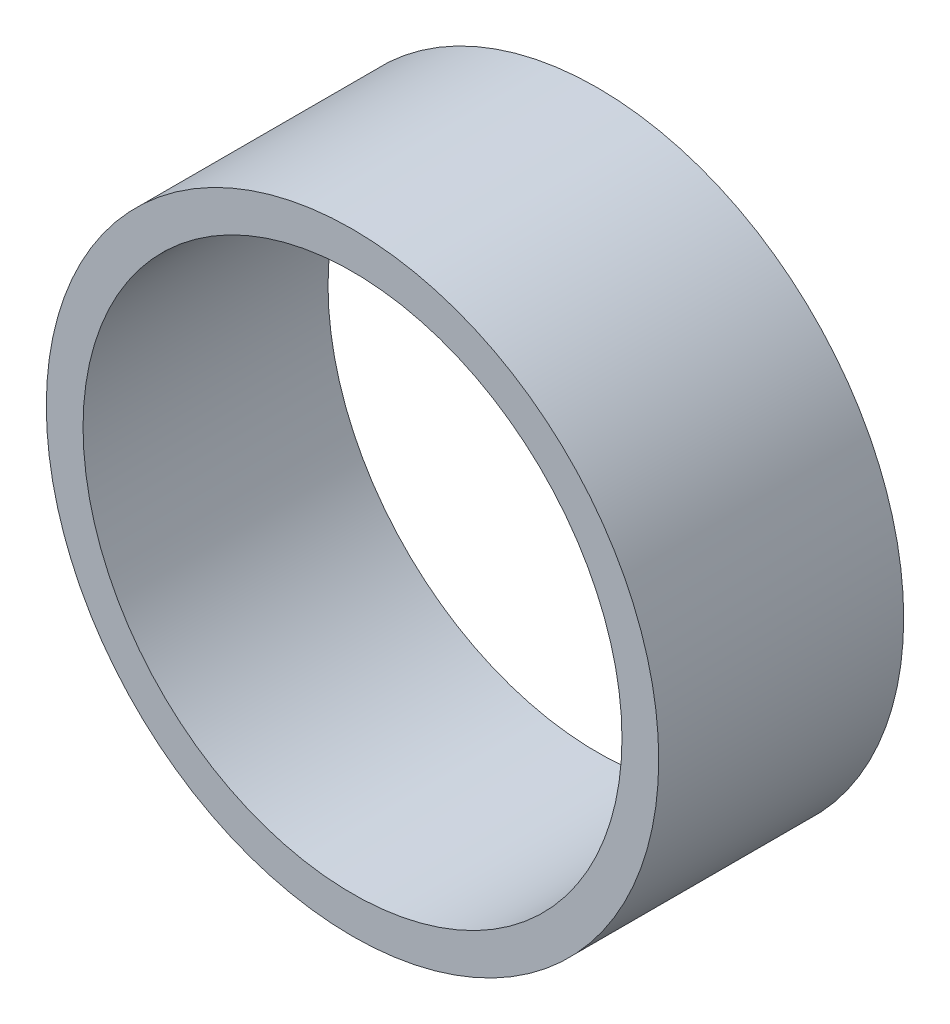
ISO-10303-21;
HEADER;
FILE_DESCRIPTION(('STEP AP214'),'2;1');
FILE_NAME('part.step','',(''),(''),'','','');
FILE_SCHEMA(('AUTOMOTIVE_DESIGN { 1 0 10303 214 1 1 1 1 }'));
ENDSEC;
DATA;
#1=APPLICATION_CONTEXT('core data for automotive mechanical design processes');
#2=APPLICATION_PROTOCOL_DEFINITION('international standard','automotive_design',2000,#1);
#3=PRODUCT_CONTEXT('',#1,'mechanical');
#4=PRODUCT('Part','Part','',(#3));
#5=PRODUCT_RELATED_PRODUCT_CATEGORY('part','',(#4));
#6=PRODUCT_DEFINITION_FORMATION('','',#4);
#7=PRODUCT_DEFINITION_CONTEXT('part definition',#1,'design');
#8=PRODUCT_DEFINITION('design','',#6,#7);
#9=PRODUCT_DEFINITION_SHAPE('','',#8);
#10=(LENGTH_UNIT() NAMED_UNIT(*) SI_UNIT(.MILLI.,.METRE.));
#11=(NAMED_UNIT(*) PLANE_ANGLE_UNIT() SI_UNIT($,.RADIAN.));
#12=(NAMED_UNIT(*) SI_UNIT($,.STERADIAN.) SOLID_ANGLE_UNIT());
#13=UNCERTAINTY_MEASURE_WITH_UNIT(LENGTH_MEASURE(1.E-05),#10,'distance_accuracy_value','');
#14=(GEOMETRIC_REPRESENTATION_CONTEXT(3) GLOBAL_UNCERTAINTY_ASSIGNED_CONTEXT((#13)) GLOBAL_UNIT_ASSIGNED_CONTEXT((#10,
#11,#12)) REPRESENTATION_CONTEXT('',''));
#15=CARTESIAN_POINT('',(0.,0.,0.));
#16=DIRECTION('',(0.,0.,1.));
#17=DIRECTION('',(1.,0.,0.));
#18=AXIS2_PLACEMENT_3D('',#15,#16,#17);
#19=CARTESIAN_POINT('',(0.,0.,20.));
#20=DIRECTION('',(0.,0.,1.));
#21=DIRECTION('',(1.,0.,0.));
#22=AXIS2_PLACEMENT_3D('',#19,#20,#21);
#23=PLANE('',#22);
#24=CARTESIAN_POINT('',(0.,0.,20.));
#25=DIRECTION('',(0.,0.,1.));
#26=DIRECTION('',(1.,0.,0.));
#27=AXIS2_PLACEMENT_3D('',#24,#25,#26);
#28=CIRCLE('',#27,25.);
#29=CARTESIAN_POINT('',(25.,0.,20.));
#30=VERTEX_POINT('',#29);
#31=EDGE_CURVE('E10',#30,#30,#28,.T.);
#32=ORIENTED_EDGE('',*,*,#31,.T.);
#33=EDGE_LOOP('',(#32));
#34=FACE_BOUND('',#33,.T.);
#35=CARTESIAN_POINT('',(0.,0.,20.));
#36=DIRECTION('',(0.,0.,1.));
#37=DIRECTION('',(1.,0.,0.));
#38=AXIS2_PLACEMENT_3D('',#35,#36,#37);
#39=CIRCLE('',#38,22.);
#40=CARTESIAN_POINT('',(22.,0.,20.));
#41=VERTEX_POINT('',#40);
#42=EDGE_CURVE('E41',#41,#41,#39,.T.);
#43=ORIENTED_EDGE('',*,*,#42,.F.);
#44=EDGE_LOOP('',(#43));
#45=FACE_BOUND('',#44,.T.);
#46=ADVANCED_FACE('F30',(#34,#45),#23,.T.);
#47=CARTESIAN_POINT('',(0.,0.,0.));
#48=DIRECTION('',(0.,0.,1.));
#49=DIRECTION('',(1.,0.,0.));
#50=AXIS2_PLACEMENT_3D('',#47,#48,#49);
#51=PLANE('',#50);
#52=CARTESIAN_POINT('',(0.,0.,0.));
#53=DIRECTION('',(0.,0.,1.));
#54=DIRECTION('',(1.,0.,0.));
#55=AXIS2_PLACEMENT_3D('',#52,#53,#54);
#56=CIRCLE('',#55,25.);
#57=CARTESIAN_POINT('',(25.,0.,0.));
#58=VERTEX_POINT('',#57);
#59=EDGE_CURVE('E34',#58,#58,#56,.T.);
#60=ORIENTED_EDGE('',*,*,#59,.F.);
#61=EDGE_LOOP('',(#60));
#62=FACE_BOUND('',#61,.T.);
#63=CARTESIAN_POINT('',(0.,0.,0.));
#64=DIRECTION('',(0.,0.,1.));
#65=DIRECTION('',(1.,0.,0.));
#66=AXIS2_PLACEMENT_3D('',#63,#64,#65);
#67=CIRCLE('',#66,22.);
#68=CARTESIAN_POINT('',(22.,0.,0.));
#69=VERTEX_POINT('',#68);
#70=EDGE_CURVE('E43',#69,#69,#67,.T.);
#71=ORIENTED_EDGE('',*,*,#70,.T.);
#72=EDGE_LOOP('',(#71));
#73=FACE_BOUND('',#72,.T.);
#74=ADVANCED_FACE('F53',(#62,#73),#51,.F.);
#75=CARTESIAN_POINT('',(0.,0.,20.));
#76=DIRECTION('',(0.,0.,-1.));
#77=DIRECTION('',(-1.,0.,0.));
#78=AXIS2_PLACEMENT_3D('',#75,#76,#77);
#79=CYLINDRICAL_SURFACE('',#78,25.);
#80=ORIENTED_EDGE('',*,*,#31,.F.);
#81=EDGE_LOOP('',(#80));
#82=FACE_BOUND('',#81,.T.);
#83=ORIENTED_EDGE('',*,*,#59,.T.);
#84=EDGE_LOOP('',(#83));
#85=FACE_BOUND('',#84,.T.);
#86=ADVANCED_FACE('F32',(#82,#85),#79,.T.);
#87=CARTESIAN_POINT('',(0.,0.,20.));
#88=DIRECTION('',(0.,0.,-1.));
#89=DIRECTION('',(-1.,0.,0.));
#90=AXIS2_PLACEMENT_3D('',#87,#88,#89);
#91=CYLINDRICAL_SURFACE('',#90,22.);
#92=ORIENTED_EDGE('',*,*,#42,.T.);
#93=EDGE_LOOP('',(#92));
#94=FACE_BOUND('',#93,.T.);
#95=ORIENTED_EDGE('',*,*,#70,.F.);
#96=EDGE_LOOP('',(#95));
#97=FACE_BOUND('',#96,.T.);
#98=ADVANCED_FACE('F49',(#94,#97),#91,.F.);
#99=CLOSED_SHELL('',(#46,#74,#86,#98));
#100=MANIFOLD_SOLID_BREP('B2',#99);
#101=ADVANCED_BREP_SHAPE_REPRESENTATION('',(#18,#100),#14);
#102=SHAPE_DEFINITION_REPRESENTATION(#9,#101);
ENDSEC;
END-ISO-10303-21;
